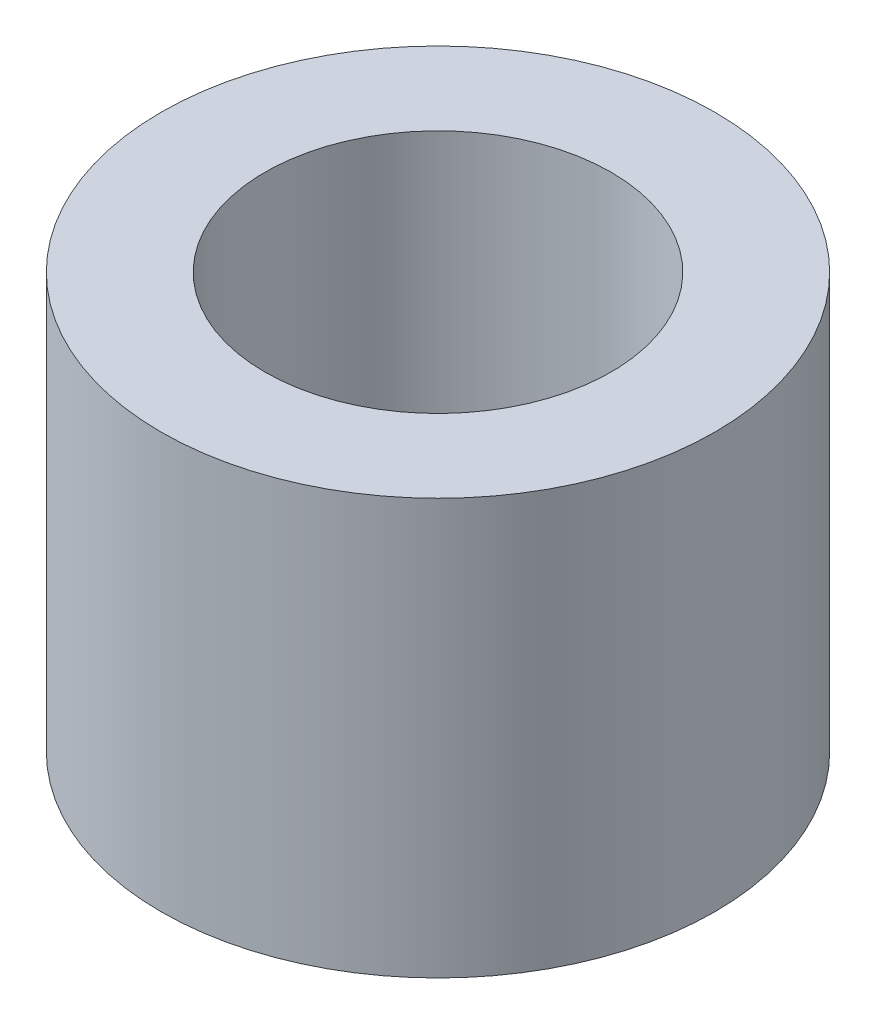
ISO-10303-21;
HEADER;
FILE_DESCRIPTION(('STEP AP214'),'2;1');
FILE_NAME('part.step','',(''),(''),'','','');
FILE_SCHEMA(('AUTOMOTIVE_DESIGN { 1 0 10303 214 1 1 1 1 }'));
ENDSEC;
DATA;
#1=APPLICATION_CONTEXT('core data for automotive mechanical design processes');
#2=APPLICATION_PROTOCOL_DEFINITION('international standard','automotive_design',2000,#1);
#3=PRODUCT_CONTEXT('',#1,'mechanical');
#4=PRODUCT('Part','Part','',(#3));
#5=PRODUCT_RELATED_PRODUCT_CATEGORY('part','',(#4));
#6=PRODUCT_DEFINITION_FORMATION('','',#4);
#7=PRODUCT_DEFINITION_CONTEXT('part definition',#1,'design');
#8=PRODUCT_DEFINITION('design','',#6,#7);
#9=PRODUCT_DEFINITION_SHAPE('','',#8);
#10=(LENGTH_UNIT() NAMED_UNIT(*) SI_UNIT(.MILLI.,.METRE.));
#11=(NAMED_UNIT(*) PLANE_ANGLE_UNIT() SI_UNIT($,.RADIAN.));
#12=(NAMED_UNIT(*) SI_UNIT($,.STERADIAN.) SOLID_ANGLE_UNIT());
#13=UNCERTAINTY_MEASURE_WITH_UNIT(LENGTH_MEASURE(1.E-05),#10,'distance_accuracy_value','');
#14=(GEOMETRIC_REPRESENTATION_CONTEXT(3) GLOBAL_UNCERTAINTY_ASSIGNED_CONTEXT((#13)) GLOBAL_UNIT_ASSIGNED_CONTEXT((#10,
#11,#12)) REPRESENTATION_CONTEXT('',''));
#15=CARTESIAN_POINT('',(0.,0.,0.));
#16=DIRECTION('',(0.,0.,1.));
#17=DIRECTION('',(1.,0.,0.));
#18=AXIS2_PLACEMENT_3D('',#15,#16,#17);
#19=CARTESIAN_POINT('',(0.,3.,0.));
#20=DIRECTION('',(0.,1.,0.));
#21=DIRECTION('',(0.,0.,1.));
#22=AXIS2_PLACEMENT_3D('',#19,#20,#21);
#23=PLANE('',#22);
#24=CARTESIAN_POINT('',(0.,3.,0.));
#25=DIRECTION('',(0.,1.,0.));
#26=DIRECTION('',(0.,0.,1.));
#27=AXIS2_PLACEMENT_3D('',#24,#25,#26);
#28=CIRCLE('',#27,4.);
#29=CARTESIAN_POINT('',(0.,3.,4.));
#30=VERTEX_POINT('',#29);
#31=EDGE_CURVE('E10',#30,#30,#28,.T.);
#32=ORIENTED_EDGE('',*,*,#31,.T.);
#33=EDGE_LOOP('',(#32));
#34=FACE_BOUND('',#33,.T.);
#35=CARTESIAN_POINT('',(0.,3.,0.));
#36=DIRECTION('',(0.,1.,0.));
#37=DIRECTION('',(0.,0.,1.));
#38=AXIS2_PLACEMENT_3D('',#35,#36,#37);
#39=CIRCLE('',#38,2.5);
#40=CARTESIAN_POINT('',(0.,3.,2.5));
#41=VERTEX_POINT('',#40);
#42=EDGE_CURVE('E56',#41,#41,#39,.T.);
#43=ORIENTED_EDGE('',*,*,#42,.F.);
#44=EDGE_LOOP('',(#43));
#45=FACE_BOUND('',#44,.T.);
#46=ADVANCED_FACE('F43',(#34,#45),#23,.T.);
#47=CARTESIAN_POINT('',(0.,-3.,0.));
#48=DIRECTION('',(0.,1.,0.));
#49=DIRECTION('',(0.,0.,1.));
#50=AXIS2_PLACEMENT_3D('',#47,#48,#49);
#51=PLANE('',#50);
#52=CARTESIAN_POINT('',(0.,-3.,0.));
#53=DIRECTION('',(0.,1.,0.));
#54=DIRECTION('',(0.,0.,1.));
#55=AXIS2_PLACEMENT_3D('',#52,#53,#54);
#56=CIRCLE('',#55,4.);
#57=CARTESIAN_POINT('',(0.,-3.,4.));
#58=VERTEX_POINT('',#57);
#59=EDGE_CURVE('E47',#58,#58,#56,.T.);
#60=ORIENTED_EDGE('',*,*,#59,.F.);
#61=EDGE_LOOP('',(#60));
#62=FACE_BOUND('',#61,.T.);
#63=CARTESIAN_POINT('',(0.,-3.,0.));
#64=DIRECTION('',(0.,1.,0.));
#65=DIRECTION('',(0.,0.,1.));
#66=AXIS2_PLACEMENT_3D('',#63,#64,#65);
#67=CIRCLE('',#66,2.5);
#68=CARTESIAN_POINT('',(0.,-3.,2.5));
#69=VERTEX_POINT('',#68);
#70=EDGE_CURVE('E58',#69,#69,#67,.T.);
#71=ORIENTED_EDGE('',*,*,#70,.T.);
#72=EDGE_LOOP('',(#71));
#73=FACE_BOUND('',#72,.T.);
#74=ADVANCED_FACE('F70',(#62,#73),#51,.F.);
#75=CARTESIAN_POINT('',(0.,3.,0.));
#76=DIRECTION('',(0.,-1.,0.));
#77=DIRECTION('',(0.,0.,-1.));
#78=AXIS2_PLACEMENT_3D('',#75,#76,#77);
#79=CYLINDRICAL_SURFACE('',#78,4.);
#80=ORIENTED_EDGE('',*,*,#31,.F.);
#81=EDGE_LOOP('',(#80));
#82=FACE_BOUND('',#81,.T.);
#83=ORIENTED_EDGE('',*,*,#59,.T.);
#84=EDGE_LOOP('',(#83));
#85=FACE_BOUND('',#84,.T.);
#86=ADVANCED_FACE('F45',(#82,#85),#79,.T.);
#87=CARTESIAN_POINT('',(0.,3.,0.));
#88=DIRECTION('',(0.,-1.,0.));
#89=DIRECTION('',(0.,0.,-1.));
#90=AXIS2_PLACEMENT_3D('',#87,#88,#89);
#91=CYLINDRICAL_SURFACE('',#90,2.5);
#92=ORIENTED_EDGE('',*,*,#42,.T.);
#93=EDGE_LOOP('',(#92));
#94=FACE_BOUND('',#93,.T.);
#95=ORIENTED_EDGE('',*,*,#70,.F.);
#96=EDGE_LOOP('',(#95));
#97=FACE_BOUND('',#96,.T.);
#98=ADVANCED_FACE('F66',(#94,#97),#91,.F.);
#99=CLOSED_SHELL('',(#46,#74,#86,#98));
#100=MANIFOLD_SOLID_BREP('B2',#99);
#101=ADVANCED_BREP_SHAPE_REPRESENTATION('',(#18,#100),#14);
#102=SHAPE_DEFINITION_REPRESENTATION(#9,#101);
ENDSEC;
END-ISO-10303-21;
